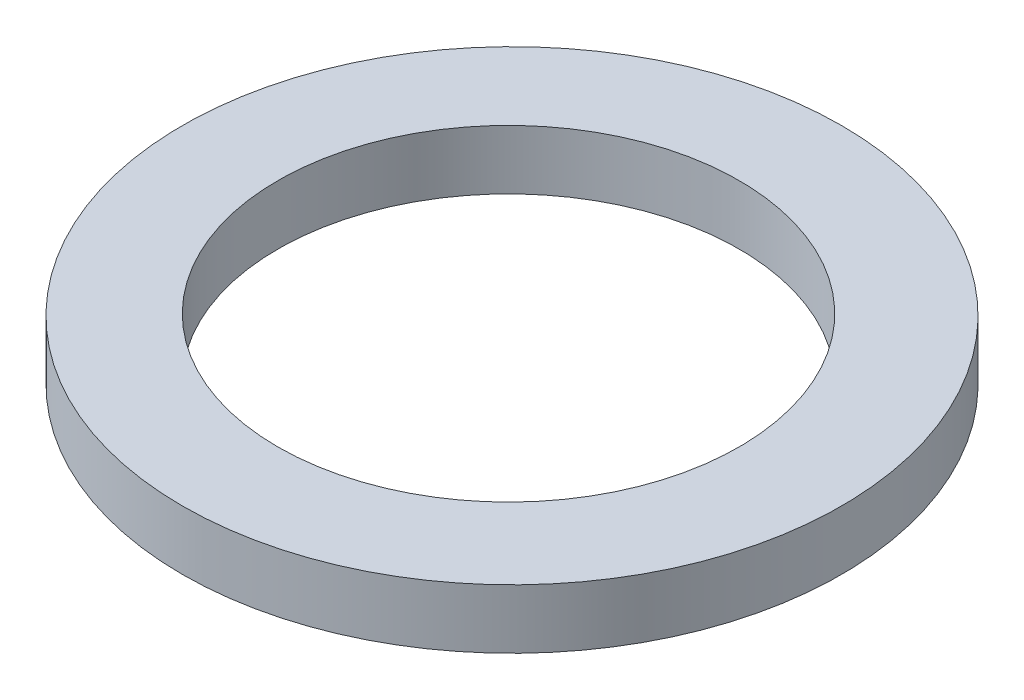
ISO-10303-21;
HEADER;
FILE_DESCRIPTION(('STEP AP214'),'2;1');
FILE_NAME('part.step','',(''),(''),'','','');
FILE_SCHEMA(('AUTOMOTIVE_DESIGN { 1 0 10303 214 1 1 1 1 }'));
ENDSEC;
DATA;
#1=APPLICATION_CONTEXT('core data for automotive mechanical design processes');
#2=APPLICATION_PROTOCOL_DEFINITION('international standard','automotive_design',2000,#1);
#3=PRODUCT_CONTEXT('',#1,'mechanical');
#4=PRODUCT('Part','Part','',(#3));
#5=PRODUCT_RELATED_PRODUCT_CATEGORY('part','',(#4));
#6=PRODUCT_DEFINITION_FORMATION('','',#4);
#7=PRODUCT_DEFINITION_CONTEXT('part definition',#1,'design');
#8=PRODUCT_DEFINITION('design','',#6,#7);
#9=PRODUCT_DEFINITION_SHAPE('','',#8);
#10=(LENGTH_UNIT() NAMED_UNIT(*) SI_UNIT(.MILLI.,.METRE.));
#11=(NAMED_UNIT(*) PLANE_ANGLE_UNIT() SI_UNIT($,.RADIAN.));
#12=(NAMED_UNIT(*) SI_UNIT($,.STERADIAN.) SOLID_ANGLE_UNIT());
#13=UNCERTAINTY_MEASURE_WITH_UNIT(LENGTH_MEASURE(1.E-05),#10,'distance_accuracy_value','');
#14=(GEOMETRIC_REPRESENTATION_CONTEXT(3) GLOBAL_UNCERTAINTY_ASSIGNED_CONTEXT((#13)) GLOBAL_UNIT_ASSIGNED_CONTEXT((#10,
#11,#12)) REPRESENTATION_CONTEXT('',''));
#15=CARTESIAN_POINT('',(0.,0.,0.));
#16=DIRECTION('',(0.,0.,1.));
#17=DIRECTION('',(1.,0.,0.));
#18=AXIS2_PLACEMENT_3D('',#15,#16,#17);
#19=CARTESIAN_POINT('',(0.268183517642549,4.572,0.));
#20=DIRECTION('',(0.,1.,0.));
#21=DIRECTION('',(0.,0.,1.));
#22=AXIS2_PLACEMENT_3D('',#19,#20,#21);
#23=PLANE('',#22);
#24=CARTESIAN_POINT('',(0.268183517642549,4.572,0.));
#25=DIRECTION('',(0.,1.,0.));
#26=DIRECTION('',(0.,0.,1.));
#27=AXIS2_PLACEMENT_3D('',#24,#25,#26);
#28=CIRCLE('',#27,25.4);
#29=CARTESIAN_POINT('',(0.268183517642549,4.572,25.4));
#30=VERTEX_POINT('',#29);
#31=EDGE_CURVE('E10',#30,#30,#28,.T.);
#32=ORIENTED_EDGE('',*,*,#31,.T.);
#33=EDGE_LOOP('',(#32));
#34=FACE_BOUND('',#33,.T.);
#35=CARTESIAN_POINT('',(0.,4.572,0.));
#36=DIRECTION('',(0.,1.,0.));
#37=DIRECTION('',(0.,0.,1.));
#38=AXIS2_PLACEMENT_3D('',#35,#36,#37);
#39=CIRCLE('',#38,17.78);
#40=CARTESIAN_POINT('',(0.,4.572,17.78));
#41=VERTEX_POINT('',#40);
#42=EDGE_CURVE('E45',#41,#41,#39,.T.);
#43=ORIENTED_EDGE('',*,*,#42,.F.);
#44=EDGE_LOOP('',(#43));
#45=FACE_BOUND('',#44,.T.);
#46=ADVANCED_FACE('F34',(#34,#45),#23,.T.);
#47=CARTESIAN_POINT('',(0.268183517642549,0.,0.));
#48=DIRECTION('',(0.,1.,0.));
#49=DIRECTION('',(0.,0.,1.));
#50=AXIS2_PLACEMENT_3D('',#47,#48,#49);
#51=PLANE('',#50);
#52=CARTESIAN_POINT('',(0.268183517642549,0.,0.));
#53=DIRECTION('',(0.,1.,0.));
#54=DIRECTION('',(0.,0.,1.));
#55=AXIS2_PLACEMENT_3D('',#52,#53,#54);
#56=CIRCLE('',#55,25.4);
#57=CARTESIAN_POINT('',(0.268183517642549,0.,25.4));
#58=VERTEX_POINT('',#57);
#59=EDGE_CURVE('E38',#58,#58,#56,.T.);
#60=ORIENTED_EDGE('',*,*,#59,.F.);
#61=EDGE_LOOP('',(#60));
#62=FACE_BOUND('',#61,.T.);
#63=CARTESIAN_POINT('',(0.,0.,0.));
#64=DIRECTION('',(0.,1.,0.));
#65=DIRECTION('',(0.,0.,1.));
#66=AXIS2_PLACEMENT_3D('',#63,#64,#65);
#67=CIRCLE('',#66,17.78);
#68=CARTESIAN_POINT('',(0.,0.,17.78));
#69=VERTEX_POINT('',#68);
#70=EDGE_CURVE('E47',#69,#69,#67,.T.);
#71=ORIENTED_EDGE('',*,*,#70,.T.);
#72=EDGE_LOOP('',(#71));
#73=FACE_BOUND('',#72,.T.);
#74=ADVANCED_FACE('F57',(#62,#73),#51,.F.);
#75=CARTESIAN_POINT('',(0.268183517642549,4.572,0.));
#76=DIRECTION('',(0.,-1.,0.));
#77=DIRECTION('',(0.,0.,-1.));
#78=AXIS2_PLACEMENT_3D('',#75,#76,#77);
#79=CYLINDRICAL_SURFACE('',#78,25.4);
#80=ORIENTED_EDGE('',*,*,#31,.F.);
#81=EDGE_LOOP('',(#80));
#82=FACE_BOUND('',#81,.T.);
#83=ORIENTED_EDGE('',*,*,#59,.T.);
#84=EDGE_LOOP('',(#83));
#85=FACE_BOUND('',#84,.T.);
#86=ADVANCED_FACE('F36',(#82,#85),#79,.T.);
#87=CARTESIAN_POINT('',(0.,4.572,0.));
#88=DIRECTION('',(0.,-1.,0.));
#89=DIRECTION('',(0.,0.,-1.));
#90=AXIS2_PLACEMENT_3D('',#87,#88,#89);
#91=CYLINDRICAL_SURFACE('',#90,17.78);
#92=ORIENTED_EDGE('',*,*,#42,.T.);
#93=EDGE_LOOP('',(#92));
#94=FACE_BOUND('',#93,.T.);
#95=ORIENTED_EDGE('',*,*,#70,.F.);
#96=EDGE_LOOP('',(#95));
#97=FACE_BOUND('',#96,.T.);
#98=ADVANCED_FACE('F53',(#94,#97),#91,.F.);
#99=CLOSED_SHELL('',(#46,#74,#86,#98));
#100=MANIFOLD_SOLID_BREP('B2',#99);
#101=ADVANCED_BREP_SHAPE_REPRESENTATION('',(#18,#100),#14);
#102=SHAPE_DEFINITION_REPRESENTATION(#9,#101);
ENDSEC;
END-ISO-10303-21;
